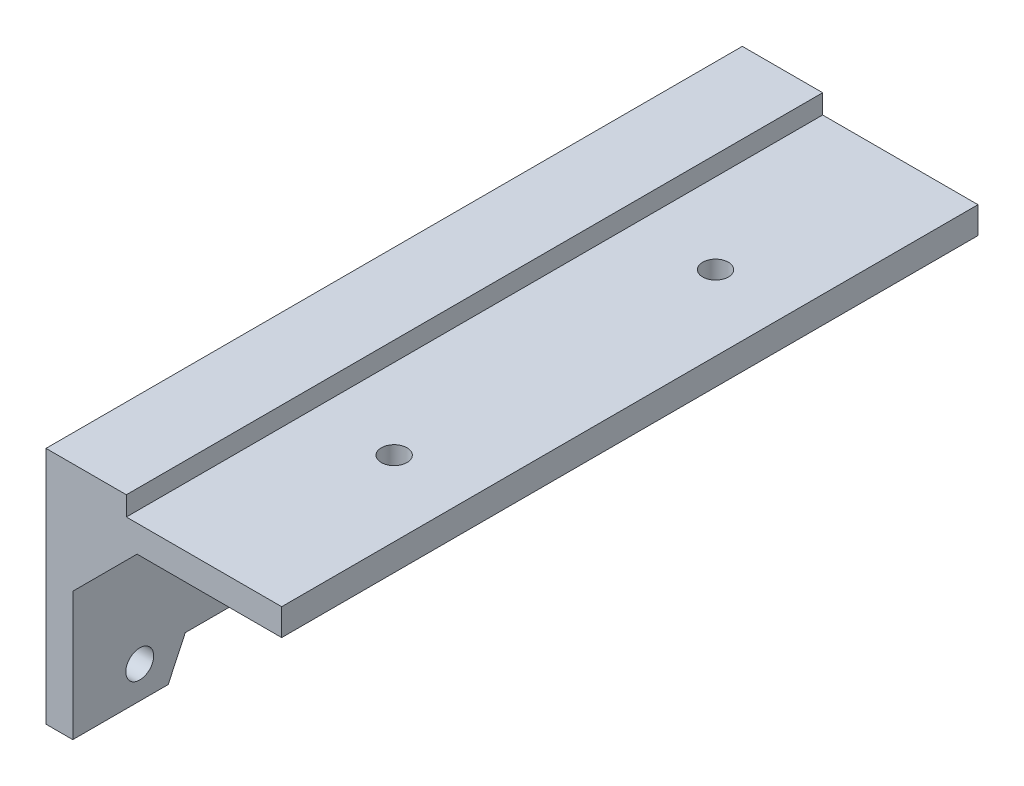
ISO-10303-21;
HEADER;
FILE_DESCRIPTION(('STEP AP214'),'2;1');
FILE_NAME('part.step','',(''),(''),'','','');
FILE_SCHEMA(('AUTOMOTIVE_DESIGN { 1 0 10303 214 1 1 1 1 }'));
ENDSEC;
DATA;
#1=APPLICATION_CONTEXT('core data for automotive mechanical design processes');
#2=APPLICATION_PROTOCOL_DEFINITION('international standard','automotive_design',2000,#1);
#3=PRODUCT_CONTEXT('',#1,'mechanical');
#4=PRODUCT('Part','Part','',(#3));
#5=PRODUCT_RELATED_PRODUCT_CATEGORY('part','',(#4));
#6=PRODUCT_DEFINITION_FORMATION('','',#4);
#7=PRODUCT_DEFINITION_CONTEXT('part definition',#1,'design');
#8=PRODUCT_DEFINITION('design','',#6,#7);
#9=PRODUCT_DEFINITION_SHAPE('','',#8);
#10=(LENGTH_UNIT() NAMED_UNIT(*) SI_UNIT(.MILLI.,.METRE.));
#11=(NAMED_UNIT(*) PLANE_ANGLE_UNIT() SI_UNIT($,.RADIAN.));
#12=(NAMED_UNIT(*) SI_UNIT($,.STERADIAN.) SOLID_ANGLE_UNIT());
#13=UNCERTAINTY_MEASURE_WITH_UNIT(LENGTH_MEASURE(1.E-05),#10,'distance_accuracy_value','');
#14=(GEOMETRIC_REPRESENTATION_CONTEXT(3) GLOBAL_UNCERTAINTY_ASSIGNED_CONTEXT((#13)) GLOBAL_UNIT_ASSIGNED_CONTEXT((#10,
#11,#12)) REPRESENTATION_CONTEXT('',''));
#15=CARTESIAN_POINT('',(0.,0.,0.));
#16=DIRECTION('',(0.,0.,1.));
#17=DIRECTION('',(1.,0.,0.));
#18=AXIS2_PLACEMENT_3D('',#15,#16,#17);
#19=CARTESIAN_POINT('',(1.5875,-13.335,-41.275));
#20=DIRECTION('',(0.,0.,1.));
#21=DIRECTION('',(1.,0.,0.));
#22=AXIS2_PLACEMENT_3D('',#19,#20,#21);
#23=PLANE('',#22);
#24=DIRECTION('',(0.,1.,0.));
#25=VECTOR('',#24,1.);
#26=CARTESIAN_POINT('',(1.5875,-13.335,-41.275));
#27=LINE('',#26,#25);
#28=CARTESIAN_POINT('',(1.5875,-9.525,-41.275));
#29=VERTEX_POINT('',#28);
#30=CARTESIAN_POINT('',(1.5875,5.715,-41.275));
#31=VERTEX_POINT('',#30);
#32=EDGE_CURVE('E46',#29,#31,#27,.T.);
#33=ORIENTED_EDGE('',*,*,#32,.F.);
#34=DIRECTION('',(-1.,0.,0.));
#35=VECTOR('',#34,1.);
#36=CARTESIAN_POINT('',(13.5228846661474,-9.525,-41.275));
#37=LINE('',#36,#35);
#38=CARTESIAN_POINT('',(-1.5875,-9.525,-41.275));
#39=VERTEX_POINT('',#38);
#40=EDGE_CURVE('E177',#29,#39,#37,.T.);
#41=ORIENTED_EDGE('',*,*,#40,.T.);
#42=DIRECTION('',(0.,1.,0.));
#43=VECTOR('',#42,1.);
#44=CARTESIAN_POINT('',(-1.5875,-13.335,-41.275));
#45=LINE('',#44,#43);
#46=CARTESIAN_POINT('',(-1.5875,18.796,-41.275));
#47=VERTEX_POINT('',#46);
#48=EDGE_CURVE('E143',#39,#47,#45,.T.);
#49=ORIENTED_EDGE('',*,*,#48,.T.);
#50=DIRECTION('',(-1.,0.,0.));
#51=VECTOR('',#50,1.);
#52=CARTESIAN_POINT('',(-1.5875,18.796,-41.275));
#53=LINE('',#52,#51);
#54=CARTESIAN_POINT('',(7.9375,18.796,-41.275));
#55=VERTEX_POINT('',#54);
#56=EDGE_CURVE('E156',#55,#47,#53,.T.);
#57=ORIENTED_EDGE('',*,*,#56,.F.);
#58=DIRECTION('',(0.,-1.,0.));
#59=VECTOR('',#58,1.);
#60=CARTESIAN_POINT('',(7.9375,18.796,-41.275));
#61=LINE('',#60,#59);
#62=CARTESIAN_POINT('',(7.9375,16.51,-41.275));
#63=VERTEX_POINT('',#62);
#64=EDGE_CURVE('E161',#55,#63,#61,.T.);
#65=ORIENTED_EDGE('',*,*,#64,.T.);
#66=DIRECTION('',(-1.,0.,0.));
#67=VECTOR('',#66,1.);
#68=CARTESIAN_POINT('',(26.3525,16.51,-41.275));
#69=LINE('',#68,#67);
#70=CARTESIAN_POINT('',(26.3525,16.51,-41.275));
#71=VERTEX_POINT('',#70);
#72=EDGE_CURVE('E245',#71,#63,#69,.T.);
#73=ORIENTED_EDGE('',*,*,#72,.F.);
#74=DIRECTION('',(0.,-1.,0.));
#75=VECTOR('',#74,1.);
#76=CARTESIAN_POINT('',(26.3525,16.51,-41.275));
#77=LINE('',#76,#75);
#78=CARTESIAN_POINT('',(26.3525,13.335,-41.275));
#79=VERTEX_POINT('',#78);
#80=EDGE_CURVE('E231',#71,#79,#77,.T.);
#81=ORIENTED_EDGE('',*,*,#80,.T.);
#82=DIRECTION('',(-1.,0.,0.));
#83=VECTOR('',#82,1.);
#84=CARTESIAN_POINT('',(26.3525,13.335,-41.275));
#85=LINE('',#84,#83);
#86=CARTESIAN_POINT('',(9.2075,13.335,-41.275));
#87=VERTEX_POINT('',#86);
#88=EDGE_CURVE('E242',#79,#87,#85,.T.);
#89=ORIENTED_EDGE('',*,*,#88,.T.);
#90=DIRECTION('',(-0.707106781186547,-0.707106781186548,0.));
#91=VECTOR('',#90,1.);
#92=CARTESIAN_POINT('',(1.5875,5.715,-41.275));
#93=LINE('',#92,#91);
#94=EDGE_CURVE('E188',#87,#31,#93,.T.);
#95=ORIENTED_EDGE('',*,*,#94,.T.);
#96=EDGE_LOOP('',(#33,#41,#49,#57,#65,#73,#81,#89,#95));
#97=FACE_BOUND('',#96,.T.);
#98=ADVANCED_FACE('F38',(#97),#23,.F.);
#99=CARTESIAN_POINT('',(1.5875,-13.335,41.275));
#100=DIRECTION('',(0.,0.,-1.));
#101=DIRECTION('',(-1.,0.,0.));
#102=AXIS2_PLACEMENT_3D('',#99,#100,#101);
#103=PLANE('',#102);
#104=DIRECTION('',(0.,-1.,0.));
#105=VECTOR('',#104,1.);
#106=CARTESIAN_POINT('',(-1.5875,-13.335,41.275));
#107=LINE('',#106,#105);
#108=CARTESIAN_POINT('',(-1.5875,18.796,41.275));
#109=VERTEX_POINT('',#108);
#110=CARTESIAN_POINT('',(-1.5875,-9.525,41.275));
#111=VERTEX_POINT('',#110);
#112=EDGE_CURVE('E41',#109,#111,#107,.T.);
#113=ORIENTED_EDGE('',*,*,#112,.T.);
#114=DIRECTION('',(-1.,0.,0.));
#115=VECTOR('',#114,1.);
#116=CARTESIAN_POINT('',(13.5228846661474,-9.525,41.275));
#117=LINE('',#116,#115);
#118=CARTESIAN_POINT('',(1.5875,-9.525,41.275));
#119=VERTEX_POINT('',#118);
#120=EDGE_CURVE('E171',#119,#111,#117,.T.);
#121=ORIENTED_EDGE('',*,*,#120,.F.);
#122=DIRECTION('',(0.,-1.,0.));
#123=VECTOR('',#122,1.);
#124=CARTESIAN_POINT('',(1.5875,-13.335,41.275));
#125=LINE('',#124,#123);
#126=CARTESIAN_POINT('',(1.5875,5.715,41.275));
#127=VERTEX_POINT('',#126);
#128=EDGE_CURVE('E11',#127,#119,#125,.T.);
#129=ORIENTED_EDGE('',*,*,#128,.F.);
#130=DIRECTION('',(0.707106781186547,0.707106781186548,0.));
#131=VECTOR('',#130,1.);
#132=CARTESIAN_POINT('',(1.5875,5.715,41.275));
#133=LINE('',#132,#131);
#134=CARTESIAN_POINT('',(9.2075,13.335,41.275));
#135=VERTEX_POINT('',#134);
#136=EDGE_CURVE('E176',#127,#135,#133,.T.);
#137=ORIENTED_EDGE('',*,*,#136,.T.);
#138=DIRECTION('',(-1.,0.,0.));
#139=VECTOR('',#138,1.);
#140=CARTESIAN_POINT('',(26.3525,13.335,41.275));
#141=LINE('',#140,#139);
#142=CARTESIAN_POINT('',(26.3525,13.335,41.275));
#143=VERTEX_POINT('',#142);
#144=EDGE_CURVE('E238',#143,#135,#141,.T.);
#145=ORIENTED_EDGE('',*,*,#144,.F.);
#146=DIRECTION('',(0.,1.,0.));
#147=VECTOR('',#146,1.);
#148=CARTESIAN_POINT('',(26.3525,16.51,41.275));
#149=LINE('',#148,#147);
#150=CARTESIAN_POINT('',(26.3525,16.51,41.275));
#151=VERTEX_POINT('',#150);
#152=EDGE_CURVE('E225',#143,#151,#149,.T.);
#153=ORIENTED_EDGE('',*,*,#152,.T.);
#154=DIRECTION('',(-1.,0.,0.));
#155=VECTOR('',#154,1.);
#156=CARTESIAN_POINT('',(26.3525,16.51,41.275));
#157=LINE('',#156,#155);
#158=CARTESIAN_POINT('',(7.9375,16.51,41.275));
#159=VERTEX_POINT('',#158);
#160=EDGE_CURVE('E237',#151,#159,#157,.T.);
#161=ORIENTED_EDGE('',*,*,#160,.T.);
#162=DIRECTION('',(0.,-1.,0.));
#163=VECTOR('',#162,1.);
#164=CARTESIAN_POINT('',(7.93750000000001,18.796,41.275));
#165=LINE('',#164,#163);
#166=CARTESIAN_POINT('',(7.93750000000001,18.796,41.275));
#167=VERTEX_POINT('',#166);
#168=EDGE_CURVE('E148',#167,#159,#165,.T.);
#169=ORIENTED_EDGE('',*,*,#168,.F.);
#170=DIRECTION('',(1.,0.,0.));
#171=VECTOR('',#170,1.);
#172=CARTESIAN_POINT('',(-1.5875,18.796,41.275));
#173=LINE('',#172,#171);
#174=EDGE_CURVE('E145',#109,#167,#173,.T.);
#175=ORIENTED_EDGE('',*,*,#174,.F.);
#176=EDGE_LOOP('',(#113,#121,#129,#137,#145,#153,#161,#169,#175));
#177=FACE_BOUND('',#176,.T.);
#178=ADVANCED_FACE('F146',(#177),#103,.F.);
#179=CARTESIAN_POINT('',(1.5875,0.,0.));
#180=DIRECTION('',(-1.,0.,0.));
#181=DIRECTION('',(0.,0.,1.));
#182=AXIS2_PLACEMENT_3D('',#179,#180,#181);
#183=PLANE('',#182);
#184=ORIENTED_EDGE('',*,*,#128,.T.);
#185=DIRECTION('',(0.,0.,1.));
#186=VECTOR('',#185,1.);
#187=CARTESIAN_POINT('',(1.5875,-9.525,41.275));
#188=LINE('',#187,#186);
#189=CARTESIAN_POINT('',(1.5875,-9.525,29.9640625));
#190=VERTEX_POINT('',#189);
#191=EDGE_CURVE('E166',#190,#119,#188,.T.);
#192=ORIENTED_EDGE('',*,*,#191,.F.);
#193=DIRECTION('',(0.,-0.905458935958869,0.424433876230719));
#194=VECTOR('',#193,1.);
#195=CARTESIAN_POINT('',(1.58750000000001,-5.20699999999999,27.94));
#196=LINE('',#195,#194);
#197=CARTESIAN_POINT('',(1.58750000000001,-5.20699999999999,27.94));
#198=VERTEX_POINT('',#197);
#199=EDGE_CURVE('E196',#198,#190,#196,.T.);
#200=ORIENTED_EDGE('',*,*,#199,.F.);
#201=DIRECTION('',(0.,0.,1.));
#202=VECTOR('',#201,1.);
#203=CARTESIAN_POINT('',(1.58750000000001,-5.207,-27.94));
#204=LINE('',#203,#202);
#205=CARTESIAN_POINT('',(1.58750000000001,-5.207,-27.94));
#206=VERTEX_POINT('',#205);
#207=EDGE_CURVE('E200',#206,#198,#204,.T.);
#208=ORIENTED_EDGE('',*,*,#207,.F.);
#209=DIRECTION('',(0.,0.905458935958869,0.424433876230719));
#210=VECTOR('',#209,1.);
#211=CARTESIAN_POINT('',(1.58750000000001,-13.335,-31.75));
#212=LINE('',#211,#210);
#213=CARTESIAN_POINT('',(1.58750000000001,-9.525,-29.9640625));
#214=VERTEX_POINT('',#213);
#215=EDGE_CURVE('E194',#214,#206,#212,.T.);
#216=ORIENTED_EDGE('',*,*,#215,.F.);
#217=DIRECTION('',(0.,0.,1.));
#218=VECTOR('',#217,1.);
#219=CARTESIAN_POINT('',(1.5875,-9.525,-41.275));
#220=LINE('',#219,#218);
#221=EDGE_CURVE('E174',#29,#214,#220,.T.);
#222=ORIENTED_EDGE('',*,*,#221,.F.);
#223=ORIENTED_EDGE('',*,*,#32,.T.);
#224=DIRECTION('',(0.,0.,1.));
#225=VECTOR('',#224,1.);
#226=CARTESIAN_POINT('',(1.5875,5.715,-52.051307345283));
#227=LINE('',#226,#225);
#228=EDGE_CURVE('E185',#31,#127,#227,.T.);
#229=ORIENTED_EDGE('',*,*,#228,.T.);
#230=EDGE_LOOP('',(#184,#192,#200,#208,#216,#222,#223,#229));
#231=FACE_BOUND('',#230,.T.);
#232=CARTESIAN_POINT('',(1.5875,-5.715,-33.3375));
#233=DIRECTION('',(-1.,0.,0.));
#234=DIRECTION('',(0.,0.,1.));
#235=AXIS2_PLACEMENT_3D('',#232,#233,#234);
#236=CIRCLE('',#235,1.651);
#237=CARTESIAN_POINT('',(1.5875,-5.715,-31.6865));
#238=VERTEX_POINT('',#237);
#239=EDGE_CURVE('E250',#238,#238,#236,.F.);
#240=ORIENTED_EDGE('',*,*,#239,.F.);
#241=EDGE_LOOP('',(#240));
#242=FACE_BOUND('',#241,.T.);
#243=CARTESIAN_POINT('',(1.5875,-5.71499999999999,33.3375));
#244=DIRECTION('',(-1.,0.,0.));
#245=DIRECTION('',(0.,0.,1.));
#246=AXIS2_PLACEMENT_3D('',#243,#244,#245);
#247=CIRCLE('',#246,1.651);
#248=CARTESIAN_POINT('',(1.5875,-5.71499999999999,34.9885));
#249=VERTEX_POINT('',#248);
#250=EDGE_CURVE('E256',#249,#249,#247,.F.);
#251=ORIENTED_EDGE('',*,*,#250,.F.);
#252=EDGE_LOOP('',(#251));
#253=FACE_BOUND('',#252,.T.);
#254=ADVANCED_FACE('F280',(#231,#242,#253),#183,.F.);
#255=CARTESIAN_POINT('',(-1.5875,0.,0.));
#256=DIRECTION('',(-1.,0.,0.));
#257=DIRECTION('',(0.,0.,1.));
#258=AXIS2_PLACEMENT_3D('',#255,#256,#257);
#259=PLANE('',#258);
#260=DIRECTION('',(0.,0.,-1.));
#261=VECTOR('',#260,1.);
#262=CARTESIAN_POINT('',(-1.5875,-9.525,41.275));
#263=LINE('',#262,#261);
#264=CARTESIAN_POINT('',(-1.5875,-9.525,29.9640625));
#265=VERTEX_POINT('',#264);
#266=EDGE_CURVE('E62',#111,#265,#263,.T.);
#267=ORIENTED_EDGE('',*,*,#266,.F.);
#268=ORIENTED_EDGE('',*,*,#112,.F.);
#269=DIRECTION('',(0.,0.,1.));
#270=VECTOR('',#269,1.);
#271=CARTESIAN_POINT('',(-1.5875,18.796,-41.275));
#272=LINE('',#271,#270);
#273=EDGE_CURVE('E139',#47,#109,#272,.T.);
#274=ORIENTED_EDGE('',*,*,#273,.F.);
#275=ORIENTED_EDGE('',*,*,#48,.F.);
#276=DIRECTION('',(0.,0.,-1.));
#277=VECTOR('',#276,1.);
#278=CARTESIAN_POINT('',(-1.5875,-9.525,-41.275));
#279=LINE('',#278,#277);
#280=CARTESIAN_POINT('',(-1.5875,-9.525,-29.9640625));
#281=VERTEX_POINT('',#280);
#282=EDGE_CURVE('E168',#281,#39,#279,.T.);
#283=ORIENTED_EDGE('',*,*,#282,.F.);
#284=DIRECTION('',(0.,-0.905458935958869,-0.424433876230719));
#285=VECTOR('',#284,1.);
#286=CARTESIAN_POINT('',(-1.5875,-13.335,-31.75));
#287=LINE('',#286,#285);
#288=CARTESIAN_POINT('',(-1.5875,-5.207,-27.94));
#289=VERTEX_POINT('',#288);
#290=EDGE_CURVE('E205',#289,#281,#287,.T.);
#291=ORIENTED_EDGE('',*,*,#290,.F.);
#292=DIRECTION('',(0.,0.,-1.));
#293=VECTOR('',#292,1.);
#294=CARTESIAN_POINT('',(-1.5875,-5.207,-27.94));
#295=LINE('',#294,#293);
#296=CARTESIAN_POINT('',(-1.5875,-5.20699999999999,27.94));
#297=VERTEX_POINT('',#296);
#298=EDGE_CURVE('E202',#297,#289,#295,.T.);
#299=ORIENTED_EDGE('',*,*,#298,.F.);
#300=DIRECTION('',(0.,0.905458935958869,-0.424433876230719));
#301=VECTOR('',#300,1.);
#302=CARTESIAN_POINT('',(-1.5875,-5.20699999999999,27.94));
#303=LINE('',#302,#301);
#304=EDGE_CURVE('E193',#265,#297,#303,.T.);
#305=ORIENTED_EDGE('',*,*,#304,.F.);
#306=EDGE_LOOP('',(#267,#268,#274,#275,#283,#291,#299,#305));
#307=FACE_BOUND('',#306,.T.);
#308=CARTESIAN_POINT('',(-1.5875,-5.715,-33.3375));
#309=DIRECTION('',(-1.,0.,0.));
#310=DIRECTION('',(0.,0.,1.));
#311=AXIS2_PLACEMENT_3D('',#308,#309,#310);
#312=CIRCLE('',#311,1.651);
#313=CARTESIAN_POINT('',(-1.5875,-5.715,-31.6865));
#314=VERTEX_POINT('',#313);
#315=EDGE_CURVE('E241',#314,#314,#312,.T.);
#316=ORIENTED_EDGE('',*,*,#315,.F.);
#317=EDGE_LOOP('',(#316));
#318=FACE_BOUND('',#317,.T.);
#319=CARTESIAN_POINT('',(-1.5875,-5.71499999999999,33.3375));
#320=DIRECTION('',(-1.,0.,0.));
#321=DIRECTION('',(0.,0.,1.));
#322=AXIS2_PLACEMENT_3D('',#319,#320,#321);
#323=CIRCLE('',#322,1.651);
#324=CARTESIAN_POINT('',(-1.5875,-5.71499999999999,34.9885));
#325=VERTEX_POINT('',#324);
#326=EDGE_CURVE('E253',#325,#325,#323,.T.);
#327=ORIENTED_EDGE('',*,*,#326,.F.);
#328=EDGE_LOOP('',(#327));
#329=FACE_BOUND('',#328,.T.);
#330=ADVANCED_FACE('F135',(#307,#318,#329),#259,.T.);
#331=CARTESIAN_POINT('',(6.25723318295596,-5.71499999999999,33.3375));
#332=DIRECTION('',(-1.,0.,0.));
#333=DIRECTION('',(0.,0.,1.));
#334=AXIS2_PLACEMENT_3D('',#331,#332,#333);
#335=CYLINDRICAL_SURFACE('',#334,1.651);
#336=ORIENTED_EDGE('',*,*,#250,.T.);
#337=EDGE_LOOP('',(#336));
#338=FACE_BOUND('',#337,.T.);
#339=ORIENTED_EDGE('',*,*,#326,.T.);
#340=EDGE_LOOP('',(#339));
#341=FACE_BOUND('',#340,.T.);
#342=ADVANCED_FACE('F319',(#338,#341),#335,.F.);
#343=CARTESIAN_POINT('',(6.25723318295596,-5.715,-33.3375));
#344=DIRECTION('',(-1.,0.,0.));
#345=DIRECTION('',(0.,0.,1.));
#346=AXIS2_PLACEMENT_3D('',#343,#344,#345);
#347=CYLINDRICAL_SURFACE('',#346,1.651);
#348=ORIENTED_EDGE('',*,*,#239,.T.);
#349=EDGE_LOOP('',(#348));
#350=FACE_BOUND('',#349,.T.);
#351=ORIENTED_EDGE('',*,*,#315,.T.);
#352=EDGE_LOOP('',(#351));
#353=FACE_BOUND('',#352,.T.);
#354=ADVANCED_FACE('F314',(#350,#353),#347,.F.);
#355=CARTESIAN_POINT('',(26.3525,13.335,-41.275));
#356=DIRECTION('',(0.,-1.,0.));
#357=DIRECTION('',(0.,0.,-1.));
#358=AXIS2_PLACEMENT_3D('',#355,#356,#357);
#359=PLANE('',#358);
#360=DIRECTION('',(0.,0.,1.));
#361=VECTOR('',#360,1.);
#362=CARTESIAN_POINT('',(9.2075,13.335,-52.051307345283));
#363=LINE('',#362,#361);
#364=EDGE_CURVE('E186',#87,#135,#363,.T.);
#365=ORIENTED_EDGE('',*,*,#364,.F.);
#366=ORIENTED_EDGE('',*,*,#88,.F.);
#367=DIRECTION('',(0.,0.,1.));
#368=VECTOR('',#367,1.);
#369=CARTESIAN_POINT('',(26.3525,13.335,-41.275));
#370=LINE('',#369,#368);
#371=EDGE_CURVE('E234',#79,#143,#370,.T.);
#372=ORIENTED_EDGE('',*,*,#371,.T.);
#373=ORIENTED_EDGE('',*,*,#144,.T.);
#374=EDGE_LOOP('',(#365,#366,#372,#373));
#375=FACE_BOUND('',#374,.T.);
#376=CARTESIAN_POINT('',(17.4625,13.335,19.05));
#377=DIRECTION('',(0.,-1.,0.));
#378=DIRECTION('',(0.,0.,-1.));
#379=AXIS2_PLACEMENT_3D('',#376,#377,#378);
#380=CIRCLE('',#379,1.524);
#381=CARTESIAN_POINT('',(17.4625,13.335,17.526));
#382=VERTEX_POINT('',#381);
#383=EDGE_CURVE('E216',#382,#382,#380,.F.);
#384=ORIENTED_EDGE('',*,*,#383,.T.);
#385=EDGE_LOOP('',(#384));
#386=FACE_BOUND('',#385,.T.);
#387=CARTESIAN_POINT('',(17.4625,13.335,-19.05));
#388=DIRECTION('',(0.,-1.,0.));
#389=DIRECTION('',(0.,0.,-1.));
#390=AXIS2_PLACEMENT_3D('',#387,#388,#389);
#391=CIRCLE('',#390,1.524);
#392=CARTESIAN_POINT('',(17.4625,13.335,-20.574));
#393=VERTEX_POINT('',#392);
#394=EDGE_CURVE('E222',#393,#393,#391,.F.);
#395=ORIENTED_EDGE('',*,*,#394,.T.);
#396=EDGE_LOOP('',(#395));
#397=FACE_BOUND('',#396,.T.);
#398=ADVANCED_FACE('F288',(#375,#386,#397),#359,.T.);
#399=CARTESIAN_POINT('',(26.3525,16.51,-41.275));
#400=DIRECTION('',(0.,1.,0.));
#401=DIRECTION('',(0.,0.,1.));
#402=AXIS2_PLACEMENT_3D('',#399,#400,#401);
#403=PLANE('',#402);
#404=DIRECTION('',(0.,0.,-1.));
#405=VECTOR('',#404,1.);
#406=CARTESIAN_POINT('',(7.9375,16.51,-41.275));
#407=LINE('',#406,#405);
#408=EDGE_CURVE('E54',#159,#63,#407,.T.);
#409=ORIENTED_EDGE('',*,*,#408,.F.);
#410=ORIENTED_EDGE('',*,*,#160,.F.);
#411=DIRECTION('',(0.,0.,-1.));
#412=VECTOR('',#411,1.);
#413=CARTESIAN_POINT('',(26.3525,16.51,-41.275));
#414=LINE('',#413,#412);
#415=EDGE_CURVE('E228',#151,#71,#414,.T.);
#416=ORIENTED_EDGE('',*,*,#415,.T.);
#417=ORIENTED_EDGE('',*,*,#72,.T.);
#418=EDGE_LOOP('',(#409,#410,#416,#417));
#419=FACE_BOUND('',#418,.T.);
#420=CARTESIAN_POINT('',(17.4625,16.51,19.05));
#421=DIRECTION('',(0.,1.,0.));
#422=DIRECTION('',(0.,0.,1.));
#423=AXIS2_PLACEMENT_3D('',#420,#421,#422);
#424=CIRCLE('',#423,1.524);
#425=CARTESIAN_POINT('',(17.4625,16.51,20.574));
#426=VERTEX_POINT('',#425);
#427=EDGE_CURVE('E213',#426,#426,#424,.T.);
#428=ORIENTED_EDGE('',*,*,#427,.F.);
#429=EDGE_LOOP('',(#428));
#430=FACE_BOUND('',#429,.T.);
#431=CARTESIAN_POINT('',(17.4625,16.51,-19.05));
#432=DIRECTION('',(0.,1.,0.));
#433=DIRECTION('',(0.,0.,1.));
#434=AXIS2_PLACEMENT_3D('',#431,#432,#433);
#435=CIRCLE('',#434,1.524);
#436=CARTESIAN_POINT('',(17.4625,16.51,-17.526));
#437=VERTEX_POINT('',#436);
#438=EDGE_CURVE('E219',#437,#437,#435,.T.);
#439=ORIENTED_EDGE('',*,*,#438,.F.);
#440=EDGE_LOOP('',(#439));
#441=FACE_BOUND('',#440,.T.);
#442=ADVANCED_FACE('F298',(#419,#430,#441),#403,.T.);
#443=CARTESIAN_POINT('',(26.3525,0.,0.));
#444=DIRECTION('',(-1.,0.,0.));
#445=DIRECTION('',(0.,0.,1.));
#446=AXIS2_PLACEMENT_3D('',#443,#444,#445);
#447=PLANE('',#446);
#448=ORIENTED_EDGE('',*,*,#152,.F.);
#449=ORIENTED_EDGE('',*,*,#371,.F.);
#450=ORIENTED_EDGE('',*,*,#80,.F.);
#451=ORIENTED_EDGE('',*,*,#415,.F.);
#452=EDGE_LOOP('',(#448,#449,#450,#451));
#453=FACE_BOUND('',#452,.T.);
#454=ADVANCED_FACE('F293',(#453),#447,.F.);
#455=CARTESIAN_POINT('',(17.4625,9.0244770618868,-19.05));
#456=DIRECTION('',(0.,1.,0.));
#457=DIRECTION('',(0.,0.,1.));
#458=AXIS2_PLACEMENT_3D('',#455,#456,#457);
#459=CYLINDRICAL_SURFACE('',#458,1.524);
#460=ORIENTED_EDGE('',*,*,#438,.T.);
#461=EDGE_LOOP('',(#460));
#462=FACE_BOUND('',#461,.T.);
#463=ORIENTED_EDGE('',*,*,#394,.F.);
#464=EDGE_LOOP('',(#463));
#465=FACE_BOUND('',#464,.T.);
#466=ADVANCED_FACE('F306',(#462,#465),#459,.F.);
#467=CARTESIAN_POINT('',(17.4625,9.0244770618868,19.05));
#468=DIRECTION('',(0.,1.,0.));
#469=DIRECTION('',(0.,0.,1.));
#470=AXIS2_PLACEMENT_3D('',#467,#468,#469);
#471=CYLINDRICAL_SURFACE('',#470,1.524);
#472=ORIENTED_EDGE('',*,*,#427,.T.);
#473=EDGE_LOOP('',(#472));
#474=FACE_BOUND('',#473,.T.);
#475=ORIENTED_EDGE('',*,*,#383,.F.);
#476=EDGE_LOOP('',(#475));
#477=FACE_BOUND('',#476,.T.);
#478=ADVANCED_FACE('F309',(#474,#477),#471,.F.);
#479=CARTESIAN_POINT('',(65.6055785716035,-5.20699999999999,27.94));
#480=DIRECTION('',(0.,0.424433876230719,0.905458935958868));
#481=DIRECTION('',(0.,-0.905458935958869,0.424433876230719));
#482=AXIS2_PLACEMENT_3D('',#479,#480,#481);
#483=PLANE('',#482);
#484=ORIENTED_EDGE('',*,*,#199,.T.);
#485=DIRECTION('',(-1.,0.,0.));
#486=VECTOR('',#485,1.);
#487=CARTESIAN_POINT('',(13.5228846661474,-9.525,29.9640625));
#488=LINE('',#487,#486);
#489=EDGE_CURVE('E169',#190,#265,#488,.T.);
#490=ORIENTED_EDGE('',*,*,#489,.T.);
#491=ORIENTED_EDGE('',*,*,#304,.T.);
#492=DIRECTION('',(-1.,0.,0.));
#493=VECTOR('',#492,1.);
#494=CARTESIAN_POINT('',(65.6055785716035,-5.20699999999999,27.94));
#495=LINE('',#494,#493);
#496=EDGE_CURVE('E208',#198,#297,#495,.T.);
#497=ORIENTED_EDGE('',*,*,#496,.F.);
#498=EDGE_LOOP('',(#484,#490,#491,#497));
#499=FACE_BOUND('',#498,.T.);
#500=ADVANCED_FACE('F275',(#499),#483,.F.);
#501=CARTESIAN_POINT('',(65.6055785716035,-13.335,-31.75));
#502=DIRECTION('',(0.,0.424433876230719,-0.905458935958868));
#503=DIRECTION('',(0.,0.905458935958869,0.424433876230719));
#504=AXIS2_PLACEMENT_3D('',#501,#502,#503);
#505=PLANE('',#504);
#506=ORIENTED_EDGE('',*,*,#290,.T.);
#507=DIRECTION('',(-1.,0.,0.));
#508=VECTOR('',#507,1.);
#509=CARTESIAN_POINT('',(13.5228846661474,-9.525,-29.9640625));
#510=LINE('',#509,#508);
#511=EDGE_CURVE('E179',#214,#281,#510,.T.);
#512=ORIENTED_EDGE('',*,*,#511,.F.);
#513=ORIENTED_EDGE('',*,*,#215,.T.);
#514=DIRECTION('',(-1.,0.,0.));
#515=VECTOR('',#514,1.);
#516=CARTESIAN_POINT('',(65.6055785716035,-5.207,-27.94));
#517=LINE('',#516,#515);
#518=EDGE_CURVE('E197',#206,#289,#517,.T.);
#519=ORIENTED_EDGE('',*,*,#518,.T.);
#520=EDGE_LOOP('',(#506,#512,#513,#519));
#521=FACE_BOUND('',#520,.T.);
#522=ADVANCED_FACE('F267',(#521),#505,.F.);
#523=CARTESIAN_POINT('',(65.6055785716035,-5.207,-27.94));
#524=DIRECTION('',(0.,1.,0.));
#525=DIRECTION('',(0.,0.,1.));
#526=AXIS2_PLACEMENT_3D('',#523,#524,#525);
#527=PLANE('',#526);
#528=ORIENTED_EDGE('',*,*,#207,.T.);
#529=ORIENTED_EDGE('',*,*,#496,.T.);
#530=ORIENTED_EDGE('',*,*,#298,.T.);
#531=ORIENTED_EDGE('',*,*,#518,.F.);
#532=EDGE_LOOP('',(#528,#529,#530,#531));
#533=FACE_BOUND('',#532,.T.);
#534=ADVANCED_FACE('F272',(#533),#527,.F.);
#535=CARTESIAN_POINT('',(1.5875,5.715,-52.051307345283));
#536=DIRECTION('',(0.707106781186548,-0.707106781186547,0.));
#537=DIRECTION('',(0.707106781186547,0.707106781186548,0.));
#538=AXIS2_PLACEMENT_3D('',#535,#536,#537);
#539=PLANE('',#538);
#540=ORIENTED_EDGE('',*,*,#94,.F.);
#541=ORIENTED_EDGE('',*,*,#364,.T.);
#542=ORIENTED_EDGE('',*,*,#136,.F.);
#543=ORIENTED_EDGE('',*,*,#228,.F.);
#544=EDGE_LOOP('',(#540,#541,#542,#543));
#545=FACE_BOUND('',#544,.T.);
#546=ADVANCED_FACE('F383',(#545),#539,.T.);
#547=CARTESIAN_POINT('',(13.5228846661474,-9.525,-41.275));
#548=DIRECTION('',(0.,1.,0.));
#549=DIRECTION('',(0.,0.,1.));
#550=AXIS2_PLACEMENT_3D('',#547,#548,#549);
#551=PLANE('',#550);
#552=ORIENTED_EDGE('',*,*,#221,.T.);
#553=ORIENTED_EDGE('',*,*,#511,.T.);
#554=ORIENTED_EDGE('',*,*,#282,.T.);
#555=ORIENTED_EDGE('',*,*,#40,.F.);
#556=EDGE_LOOP('',(#552,#553,#554,#555));
#557=FACE_BOUND('',#556,.T.);
#558=ADVANCED_FACE('F401',(#557),#551,.F.);
#559=CARTESIAN_POINT('',(13.5228846661474,-9.525,41.275));
#560=DIRECTION('',(0.,1.,0.));
#561=DIRECTION('',(0.,0.,1.));
#562=AXIS2_PLACEMENT_3D('',#559,#560,#561);
#563=PLANE('',#562);
#564=ORIENTED_EDGE('',*,*,#191,.T.);
#565=ORIENTED_EDGE('',*,*,#120,.T.);
#566=ORIENTED_EDGE('',*,*,#266,.T.);
#567=ORIENTED_EDGE('',*,*,#489,.F.);
#568=EDGE_LOOP('',(#564,#565,#566,#567));
#569=FACE_BOUND('',#568,.T.);
#570=ADVANCED_FACE('F278',(#569),#563,.F.);
#571=CARTESIAN_POINT('',(7.9375,18.796,-41.275));
#572=DIRECTION('',(-1.,0.,0.));
#573=DIRECTION('',(0.,0.,1.));
#574=AXIS2_PLACEMENT_3D('',#571,#572,#573);
#575=PLANE('',#574);
#576=ORIENTED_EDGE('',*,*,#408,.T.);
#577=ORIENTED_EDGE('',*,*,#64,.F.);
#578=DIRECTION('',(0.,0.,-1.));
#579=VECTOR('',#578,1.);
#580=CARTESIAN_POINT('',(7.9375,18.796,-41.275));
#581=LINE('',#580,#579);
#582=EDGE_CURVE('E151',#167,#55,#581,.T.);
#583=ORIENTED_EDGE('',*,*,#582,.F.);
#584=ORIENTED_EDGE('',*,*,#168,.T.);
#585=EDGE_LOOP('',(#576,#577,#583,#584));
#586=FACE_BOUND('',#585,.T.);
#587=ADVANCED_FACE('F296',(#586),#575,.F.);
#588=CARTESIAN_POINT('',(0.,18.796,0.));
#589=DIRECTION('',(0.,1.,0.));
#590=DIRECTION('',(0.,0.,1.));
#591=AXIS2_PLACEMENT_3D('',#588,#589,#590);
#592=PLANE('',#591);
#593=ORIENTED_EDGE('',*,*,#273,.T.);
#594=ORIENTED_EDGE('',*,*,#174,.T.);
#595=ORIENTED_EDGE('',*,*,#582,.T.);
#596=ORIENTED_EDGE('',*,*,#56,.T.);
#597=EDGE_LOOP('',(#593,#594,#595,#596));
#598=FACE_BOUND('',#597,.T.);
#599=ADVANCED_FACE('F154',(#598),#592,.T.);
#600=CLOSED_SHELL('',(#98,#178,#254,#330,#342,#354,#398,#442,#454,#466,#478,#500,#522,#534,#546,
#558,#570,#587,#599));
#601=MANIFOLD_SOLID_BREP('B2',#600);
#602=ADVANCED_BREP_SHAPE_REPRESENTATION('',(#18,#601),#14);
#603=SHAPE_DEFINITION_REPRESENTATION(#9,#602);
ENDSEC;
END-ISO-10303-21;
